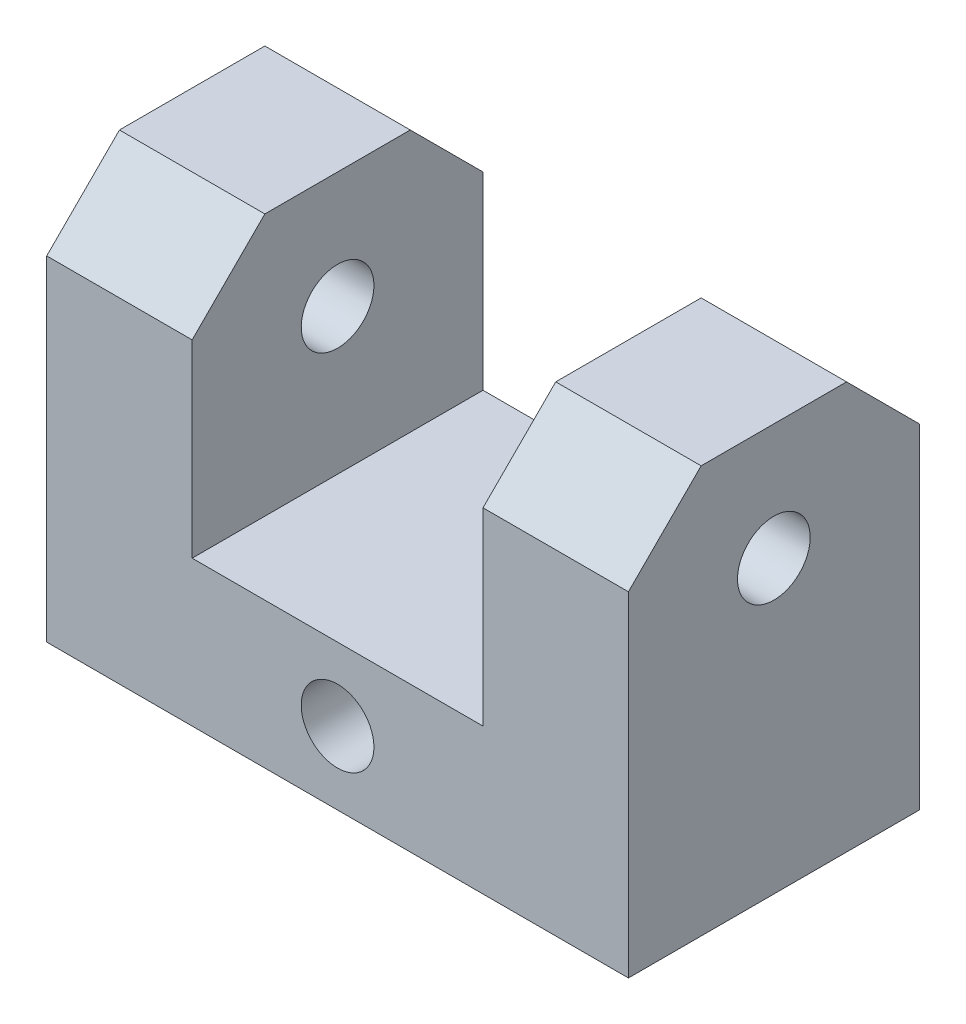
ISO-10303-21;
HEADER;
FILE_DESCRIPTION(('STEP AP214'),'2;1');
FILE_NAME('part.step','',(''),(''),'','','');
FILE_SCHEMA(('AUTOMOTIVE_DESIGN { 1 0 10303 214 1 1 1 1 }'));
ENDSEC;
DATA;
#1=APPLICATION_CONTEXT('core data for automotive mechanical design processes');
#2=APPLICATION_PROTOCOL_DEFINITION('international standard','automotive_design',2000,#1);
#3=PRODUCT_CONTEXT('',#1,'mechanical');
#4=PRODUCT('Part','Part','',(#3));
#5=PRODUCT_RELATED_PRODUCT_CATEGORY('part','',(#4));
#6=PRODUCT_DEFINITION_FORMATION('','',#4);
#7=PRODUCT_DEFINITION_CONTEXT('part definition',#1,'design');
#8=PRODUCT_DEFINITION('design','',#6,#7);
#9=PRODUCT_DEFINITION_SHAPE('','',#8);
#10=(LENGTH_UNIT() NAMED_UNIT(*) SI_UNIT(.MILLI.,.METRE.));
#11=(NAMED_UNIT(*) PLANE_ANGLE_UNIT() SI_UNIT($,.RADIAN.));
#12=(NAMED_UNIT(*) SI_UNIT($,.STERADIAN.) SOLID_ANGLE_UNIT());
#13=UNCERTAINTY_MEASURE_WITH_UNIT(LENGTH_MEASURE(1.E-05),#10,'distance_accuracy_value','');
#14=(GEOMETRIC_REPRESENTATION_CONTEXT(3) GLOBAL_UNCERTAINTY_ASSIGNED_CONTEXT((#13)) GLOBAL_UNIT_ASSIGNED_CONTEXT((#10,
#11,#12)) REPRESENTATION_CONTEXT('',''));
#15=CARTESIAN_POINT('',(0.,0.,0.));
#16=DIRECTION('',(0.,0.,1.));
#17=DIRECTION('',(1.,0.,0.));
#18=AXIS2_PLACEMENT_3D('',#15,#16,#17);
#19=CARTESIAN_POINT('',(0.,35.56,0.));
#20=DIRECTION('',(0.,-1.,0.));
#21=DIRECTION('',(0.,0.,-1.));
#22=AXIS2_PLACEMENT_3D('',#19,#20,#21);
#23=PLANE('',#22);
#24=DIRECTION('',(0.,0.,1.));
#25=VECTOR('',#24,1.);
#26=CARTESIAN_POINT('',(-25.4,35.56,-12.7));
#27=LINE('',#26,#25);
#28=CARTESIAN_POINT('',(-25.4,35.56,-6.34999999999999));
#29=VERTEX_POINT('',#28);
#30=CARTESIAN_POINT('',(-25.4,35.56,6.35));
#31=VERTEX_POINT('',#30);
#32=EDGE_CURVE('E166',#29,#31,#27,.T.);
#33=ORIENTED_EDGE('',*,*,#32,.T.);
#34=DIRECTION('',(1.,0.,0.));
#35=VECTOR('',#34,1.);
#36=CARTESIAN_POINT('',(0.,35.56,6.35));
#37=LINE('',#36,#35);
#38=CARTESIAN_POINT('',(-12.7,35.56,6.35));
#39=VERTEX_POINT('',#38);
#40=EDGE_CURVE('E198',#31,#39,#37,.T.);
#41=ORIENTED_EDGE('',*,*,#40,.T.);
#42=DIRECTION('',(0.,0.,1.));
#43=VECTOR('',#42,1.);
#44=CARTESIAN_POINT('',(-12.7,35.56,-12.7));
#45=LINE('',#44,#43);
#46=CARTESIAN_POINT('',(-12.7,35.56,-6.35));
#47=VERTEX_POINT('',#46);
#48=EDGE_CURVE('E154',#47,#39,#45,.T.);
#49=ORIENTED_EDGE('',*,*,#48,.F.);
#50=DIRECTION('',(-1.,0.,0.));
#51=VECTOR('',#50,1.);
#52=CARTESIAN_POINT('',(0.,35.56,-6.35));
#53=LINE('',#52,#51);
#54=EDGE_CURVE('E190',#47,#29,#53,.T.);
#55=ORIENTED_EDGE('',*,*,#54,.T.);
#56=EDGE_LOOP('',(#33,#41,#49,#55));
#57=FACE_BOUND('',#56,.T.);
#58=ADVANCED_FACE('F33',(#57),#23,.F.);
#59=CARTESIAN_POINT('',(-25.4,35.56,-12.7));
#60=DIRECTION('',(1.,0.,0.));
#61=DIRECTION('',(0.,0.,-1.));
#62=AXIS2_PLACEMENT_3D('',#59,#60,#61);
#63=PLANE('',#62);
#64=CARTESIAN_POINT('',(-25.4,25.4,0.));
#65=DIRECTION('',(1.,0.,0.));
#66=DIRECTION('',(0.,0.,-1.));
#67=AXIS2_PLACEMENT_3D('',#64,#65,#66);
#68=CIRCLE('',#67,3.175);
#69=CARTESIAN_POINT('',(-25.4,25.4,-3.17499999999999));
#70=VERTEX_POINT('',#69);
#71=EDGE_CURVE('E195',#70,#70,#68,.T.);
#72=ORIENTED_EDGE('',*,*,#71,.T.);
#73=EDGE_LOOP('',(#72));
#74=FACE_BOUND('',#73,.T.);
#75=DIRECTION('',(0.,-1.,0.));
#76=VECTOR('',#75,1.);
#77=CARTESIAN_POINT('',(-25.4,35.56,12.7));
#78=LINE('',#77,#76);
#79=CARTESIAN_POINT('',(-25.4,29.21,12.7));
#80=VERTEX_POINT('',#79);
#81=CARTESIAN_POINT('',(-25.4,0.,12.7));
#82=VERTEX_POINT('',#81);
#83=EDGE_CURVE('E188',#80,#82,#78,.T.);
#84=ORIENTED_EDGE('',*,*,#83,.F.);
#85=DIRECTION('',(0.,-0.707106781186549,0.707106781186546));
#86=VECTOR('',#85,1.);
#87=CARTESIAN_POINT('',(-25.4,35.56,6.35));
#88=LINE('',#87,#86);
#89=EDGE_CURVE('E211',#80,#31,#88,.F.);
#90=ORIENTED_EDGE('',*,*,#89,.T.);
#91=ORIENTED_EDGE('',*,*,#32,.F.);
#92=DIRECTION('',(0.,0.707106781186549,0.707106781186546));
#93=VECTOR('',#92,1.);
#94=CARTESIAN_POINT('',(-25.4,35.56,-6.34999999999999));
#95=LINE('',#94,#93);
#96=CARTESIAN_POINT('',(-25.4,29.21,-12.7));
#97=VERTEX_POINT('',#96);
#98=EDGE_CURVE('E209',#29,#97,#95,.F.);
#99=ORIENTED_EDGE('',*,*,#98,.T.);
#100=DIRECTION('',(0.,-1.,0.));
#101=VECTOR('',#100,1.);
#102=CARTESIAN_POINT('',(-25.4,35.56,-12.7));
#103=LINE('',#102,#101);
#104=CARTESIAN_POINT('',(-25.4,0.,-12.7));
#105=VERTEX_POINT('',#104);
#106=EDGE_CURVE('E172',#97,#105,#103,.T.);
#107=ORIENTED_EDGE('',*,*,#106,.T.);
#108=DIRECTION('',(0.,0.,1.));
#109=VECTOR('',#108,1.);
#110=CARTESIAN_POINT('',(-25.4,0.,-12.7));
#111=LINE('',#110,#109);
#112=EDGE_CURVE('E165',#105,#82,#111,.T.);
#113=ORIENTED_EDGE('',*,*,#112,.T.);
#114=EDGE_LOOP('',(#84,#90,#91,#99,#107,#113));
#115=FACE_BOUND('',#114,.T.);
#116=ADVANCED_FACE('F258',(#74,#115),#63,.F.);
#117=CARTESIAN_POINT('',(25.4,35.56,12.7));
#118=DIRECTION('',(0.,0.,-1.));
#119=DIRECTION('',(-1.,0.,0.));
#120=AXIS2_PLACEMENT_3D('',#117,#118,#119);
#121=PLANE('',#120);
#122=CARTESIAN_POINT('',(0.,6.35,12.7));
#123=DIRECTION('',(0.,0.,-1.));
#124=DIRECTION('',(-1.,0.,0.));
#125=AXIS2_PLACEMENT_3D('',#122,#123,#124);
#126=CIRCLE('',#125,3.175);
#127=CARTESIAN_POINT('',(3.175,6.35,12.7));
#128=VERTEX_POINT('',#127);
#129=EDGE_CURVE('E133',#128,#128,#126,.T.);
#130=ORIENTED_EDGE('',*,*,#129,.T.);
#131=EDGE_LOOP('',(#130));
#132=FACE_BOUND('',#131,.T.);
#133=DIRECTION('',(0.,1.,0.));
#134=VECTOR('',#133,1.);
#135=CARTESIAN_POINT('',(-12.7,35.56,12.7));
#136=LINE('',#135,#134);
#137=CARTESIAN_POINT('',(-12.7,12.7,12.7));
#138=VERTEX_POINT('',#137);
#139=CARTESIAN_POINT('',(-12.7,29.21,12.7));
#140=VERTEX_POINT('',#139);
#141=EDGE_CURVE('E140',#138,#140,#136,.T.);
#142=ORIENTED_EDGE('',*,*,#141,.T.);
#143=DIRECTION('',(-1.,0.,0.));
#144=VECTOR('',#143,1.);
#145=CARTESIAN_POINT('',(25.4,29.21,12.7));
#146=LINE('',#145,#144);
#147=EDGE_CURVE('E207',#140,#80,#146,.T.);
#148=ORIENTED_EDGE('',*,*,#147,.T.);
#149=ORIENTED_EDGE('',*,*,#83,.T.);
#150=DIRECTION('',(1.,0.,0.));
#151=VECTOR('',#150,1.);
#152=CARTESIAN_POINT('',(25.4,0.,12.7));
#153=LINE('',#152,#151);
#154=CARTESIAN_POINT('',(25.4,0.,12.7));
#155=VERTEX_POINT('',#154);
#156=EDGE_CURVE('E175',#82,#155,#153,.T.);
#157=ORIENTED_EDGE('',*,*,#156,.T.);
#158=DIRECTION('',(0.,-1.,0.));
#159=VECTOR('',#158,1.);
#160=CARTESIAN_POINT('',(25.4,35.56,12.7));
#161=LINE('',#160,#159);
#162=CARTESIAN_POINT('',(25.4,29.21,12.7));
#163=VERTEX_POINT('',#162);
#164=EDGE_CURVE('E186',#163,#155,#161,.T.);
#165=ORIENTED_EDGE('',*,*,#164,.F.);
#166=DIRECTION('',(-1.,0.,0.));
#167=VECTOR('',#166,1.);
#168=CARTESIAN_POINT('',(25.4,29.21,12.7));
#169=LINE('',#168,#167);
#170=CARTESIAN_POINT('',(12.7,29.21,12.7));
#171=VERTEX_POINT('',#170);
#172=EDGE_CURVE('E205',#163,#171,#169,.T.);
#173=ORIENTED_EDGE('',*,*,#172,.T.);
#174=DIRECTION('',(0.,-1.,0.));
#175=VECTOR('',#174,1.);
#176=CARTESIAN_POINT('',(12.7,35.56,12.7));
#177=LINE('',#176,#175);
#178=CARTESIAN_POINT('',(12.7,12.7,12.7));
#179=VERTEX_POINT('',#178);
#180=EDGE_CURVE('E156',#171,#179,#177,.T.);
#181=ORIENTED_EDGE('',*,*,#180,.T.);
#182=DIRECTION('',(-1.,0.,0.));
#183=VECTOR('',#182,1.);
#184=CARTESIAN_POINT('',(25.4,12.7,12.7));
#185=LINE('',#184,#183);
#186=EDGE_CURVE('E163',#179,#138,#185,.T.);
#187=ORIENTED_EDGE('',*,*,#186,.T.);
#188=EDGE_LOOP('',(#142,#148,#149,#157,#165,#173,#181,#187));
#189=FACE_BOUND('',#188,.T.);
#190=ADVANCED_FACE('F227',(#132,#189),#121,.F.);
#191=CARTESIAN_POINT('',(25.4,35.56,-12.7));
#192=DIRECTION('',(-1.,0.,0.));
#193=DIRECTION('',(0.,0.,1.));
#194=AXIS2_PLACEMENT_3D('',#191,#192,#193);
#195=PLANE('',#194);
#196=CARTESIAN_POINT('',(25.4,25.4,0.));
#197=DIRECTION('',(-1.,0.,0.));
#198=DIRECTION('',(0.,0.,1.));
#199=AXIS2_PLACEMENT_3D('',#196,#197,#198);
#200=CIRCLE('',#199,3.175);
#201=CARTESIAN_POINT('',(25.4,25.4,3.17500000000001));
#202=VERTEX_POINT('',#201);
#203=EDGE_CURVE('E410',#202,#202,#200,.T.);
#204=ORIENTED_EDGE('',*,*,#203,.T.);
#205=EDGE_LOOP('',(#204));
#206=FACE_BOUND('',#205,.T.);
#207=DIRECTION('',(0.,-1.,0.));
#208=VECTOR('',#207,1.);
#209=CARTESIAN_POINT('',(25.4,35.56,-12.7));
#210=LINE('',#209,#208);
#211=CARTESIAN_POINT('',(25.4,29.21,-12.7));
#212=VERTEX_POINT('',#211);
#213=CARTESIAN_POINT('',(25.4,0.,-12.7));
#214=VERTEX_POINT('',#213);
#215=EDGE_CURVE('E184',#212,#214,#210,.T.);
#216=ORIENTED_EDGE('',*,*,#215,.F.);
#217=DIRECTION('',(0.,-0.707106781186549,-0.707106781186546));
#218=VECTOR('',#217,1.);
#219=CARTESIAN_POINT('',(25.4,35.56,-6.35000000000001));
#220=LINE('',#219,#218);
#221=CARTESIAN_POINT('',(25.4,35.56,-6.35000000000001));
#222=VERTEX_POINT('',#221);
#223=EDGE_CURVE('E11',#212,#222,#220,.F.);
#224=ORIENTED_EDGE('',*,*,#223,.T.);
#225=DIRECTION('',(0.,0.,-1.));
#226=VECTOR('',#225,1.);
#227=CARTESIAN_POINT('',(25.4,35.56,-12.7));
#228=LINE('',#227,#226);
#229=CARTESIAN_POINT('',(25.4,35.56,6.35000000000001));
#230=VERTEX_POINT('',#229);
#231=EDGE_CURVE('E169',#230,#222,#228,.T.);
#232=ORIENTED_EDGE('',*,*,#231,.F.);
#233=DIRECTION('',(0.,0.707106781186549,-0.707106781186546));
#234=VECTOR('',#233,1.);
#235=CARTESIAN_POINT('',(25.4,35.56,6.35000000000001));
#236=LINE('',#235,#234);
#237=EDGE_CURVE('E41',#230,#163,#236,.F.);
#238=ORIENTED_EDGE('',*,*,#237,.T.);
#239=ORIENTED_EDGE('',*,*,#164,.T.);
#240=DIRECTION('',(0.,0.,-1.));
#241=VECTOR('',#240,1.);
#242=CARTESIAN_POINT('',(25.4,0.,-12.7));
#243=LINE('',#242,#241);
#244=EDGE_CURVE('E178',#155,#214,#243,.T.);
#245=ORIENTED_EDGE('',*,*,#244,.T.);
#246=EDGE_LOOP('',(#216,#224,#232,#238,#239,#245));
#247=FACE_BOUND('',#246,.T.);
#248=ADVANCED_FACE('F225',(#206,#247),#195,.F.);
#249=CARTESIAN_POINT('',(25.4,35.56,-12.7));
#250=DIRECTION('',(0.,0.,1.));
#251=DIRECTION('',(1.,0.,0.));
#252=AXIS2_PLACEMENT_3D('',#249,#250,#251);
#253=PLANE('',#252);
#254=CARTESIAN_POINT('',(0.,6.35,-12.7));
#255=DIRECTION('',(0.,0.,1.));
#256=DIRECTION('',(1.,0.,0.));
#257=AXIS2_PLACEMENT_3D('',#254,#255,#256);
#258=CIRCLE('',#257,3.175);
#259=CARTESIAN_POINT('',(3.175,6.35,-12.7));
#260=VERTEX_POINT('',#259);
#261=EDGE_CURVE('E407',#260,#260,#258,.T.);
#262=ORIENTED_EDGE('',*,*,#261,.T.);
#263=EDGE_LOOP('',(#262));
#264=FACE_BOUND('',#263,.T.);
#265=ORIENTED_EDGE('',*,*,#106,.F.);
#266=DIRECTION('',(1.,0.,0.));
#267=VECTOR('',#266,1.);
#268=CARTESIAN_POINT('',(25.4,29.21,-12.7));
#269=LINE('',#268,#267);
#270=CARTESIAN_POINT('',(-12.7,29.21,-12.7));
#271=VERTEX_POINT('',#270);
#272=EDGE_CURVE('E130',#97,#271,#269,.T.);
#273=ORIENTED_EDGE('',*,*,#272,.T.);
#274=DIRECTION('',(0.,-1.,0.));
#275=VECTOR('',#274,1.);
#276=CARTESIAN_POINT('',(-12.7,35.56,-12.7));
#277=LINE('',#276,#275);
#278=CARTESIAN_POINT('',(-12.7,12.7,-12.7));
#279=VERTEX_POINT('',#278);
#280=EDGE_CURVE('E122',#271,#279,#277,.T.);
#281=ORIENTED_EDGE('',*,*,#280,.T.);
#282=DIRECTION('',(1.,0.,0.));
#283=VECTOR('',#282,1.);
#284=CARTESIAN_POINT('',(-12.7,12.7,-12.7));
#285=LINE('',#284,#283);
#286=CARTESIAN_POINT('',(12.7,12.7,-12.7));
#287=VERTEX_POINT('',#286);
#288=EDGE_CURVE('E128',#279,#287,#285,.T.);
#289=ORIENTED_EDGE('',*,*,#288,.T.);
#290=DIRECTION('',(0.,1.,0.));
#291=VECTOR('',#290,1.);
#292=CARTESIAN_POINT('',(12.7,35.56,-12.7));
#293=LINE('',#292,#291);
#294=CARTESIAN_POINT('',(12.7,29.21,-12.7));
#295=VERTEX_POINT('',#294);
#296=EDGE_CURVE('E145',#287,#295,#293,.T.);
#297=ORIENTED_EDGE('',*,*,#296,.T.);
#298=DIRECTION('',(1.,0.,0.));
#299=VECTOR('',#298,1.);
#300=CARTESIAN_POINT('',(25.4,29.21,-12.7));
#301=LINE('',#300,#299);
#302=EDGE_CURVE('E213',#295,#212,#301,.T.);
#303=ORIENTED_EDGE('',*,*,#302,.T.);
#304=ORIENTED_EDGE('',*,*,#215,.T.);
#305=DIRECTION('',(-1.,0.,0.));
#306=VECTOR('',#305,1.);
#307=CARTESIAN_POINT('',(25.4,0.,-12.7));
#308=LINE('',#307,#306);
#309=EDGE_CURVE('E170',#214,#105,#308,.T.);
#310=ORIENTED_EDGE('',*,*,#309,.T.);
#311=EDGE_LOOP('',(#265,#273,#281,#289,#297,#303,#304,#310));
#312=FACE_BOUND('',#311,.T.);
#313=ADVANCED_FACE('F125',(#264,#312),#253,.F.);
#314=ORIENTED_EDGE('',*,*,#231,.T.);
#315=DIRECTION('',(-1.,0.,0.));
#316=VECTOR('',#315,1.);
#317=CARTESIAN_POINT('',(0.,35.56,-6.35000000000001));
#318=LINE('',#317,#316);
#319=CARTESIAN_POINT('',(12.7,35.56,-6.35000000000001));
#320=VERTEX_POINT('',#319);
#321=EDGE_CURVE('E218',#222,#320,#318,.T.);
#322=ORIENTED_EDGE('',*,*,#321,.T.);
#323=DIRECTION('',(0.,0.,1.));
#324=VECTOR('',#323,1.);
#325=CARTESIAN_POINT('',(12.7,35.56,-12.7));
#326=LINE('',#325,#324);
#327=CARTESIAN_POINT('',(12.7,35.56,6.35));
#328=VERTEX_POINT('',#327);
#329=EDGE_CURVE('E157',#320,#328,#326,.T.);
#330=ORIENTED_EDGE('',*,*,#329,.T.);
#331=DIRECTION('',(1.,0.,0.));
#332=VECTOR('',#331,1.);
#333=CARTESIAN_POINT('',(0.,35.56,6.35000000000002));
#334=LINE('',#333,#332);
#335=EDGE_CURVE('E216',#328,#230,#334,.T.);
#336=ORIENTED_EDGE('',*,*,#335,.T.);
#337=EDGE_LOOP('',(#314,#322,#330,#336));
#338=FACE_BOUND('',#337,.T.);
#339=ADVANCED_FACE('F236',(#338),#23,.F.);
#340=CARTESIAN_POINT('',(0.,0.,0.));
#341=DIRECTION('',(0.,-1.,0.));
#342=DIRECTION('',(0.,0.,-1.));
#343=AXIS2_PLACEMENT_3D('',#340,#341,#342);
#344=PLANE('',#343);
#345=ORIENTED_EDGE('',*,*,#112,.F.);
#346=ORIENTED_EDGE('',*,*,#309,.F.);
#347=ORIENTED_EDGE('',*,*,#244,.F.);
#348=ORIENTED_EDGE('',*,*,#156,.F.);
#349=EDGE_LOOP('',(#345,#346,#347,#348));
#350=FACE_BOUND('',#349,.T.);
#351=ADVANCED_FACE('F244',(#350),#344,.T.);
#352=CARTESIAN_POINT('',(-12.7,12.7,-12.7));
#353=DIRECTION('',(0.,-1.,0.));
#354=DIRECTION('',(0.,0.,-1.));
#355=AXIS2_PLACEMENT_3D('',#352,#353,#354);
#356=PLANE('',#355);
#357=DIRECTION('',(0.,0.,1.));
#358=VECTOR('',#357,1.);
#359=CARTESIAN_POINT('',(12.7,12.7,-12.7));
#360=LINE('',#359,#358);
#361=EDGE_CURVE('E144',#287,#179,#360,.T.);
#362=ORIENTED_EDGE('',*,*,#361,.F.);
#363=ORIENTED_EDGE('',*,*,#288,.F.);
#364=DIRECTION('',(0.,0.,1.));
#365=VECTOR('',#364,1.);
#366=CARTESIAN_POINT('',(-12.7,12.7,-12.7));
#367=LINE('',#366,#365);
#368=EDGE_CURVE('E136',#279,#138,#367,.T.);
#369=ORIENTED_EDGE('',*,*,#368,.T.);
#370=ORIENTED_EDGE('',*,*,#186,.F.);
#371=EDGE_LOOP('',(#362,#363,#369,#370));
#372=FACE_BOUND('',#371,.T.);
#373=ADVANCED_FACE('F147',(#372),#356,.F.);
#374=CARTESIAN_POINT('',(-12.7,35.56,-12.7));
#375=DIRECTION('',(-1.,0.,0.));
#376=DIRECTION('',(0.,-1.,0.));
#377=AXIS2_PLACEMENT_3D('',#374,#375,#376);
#378=PLANE('',#377);
#379=CARTESIAN_POINT('',(-12.7,25.4,0.));
#380=DIRECTION('',(-1.,0.,0.));
#381=DIRECTION('',(0.,-1.,0.));
#382=AXIS2_PLACEMENT_3D('',#379,#380,#381);
#383=CIRCLE('',#382,3.175);
#384=CARTESIAN_POINT('',(-12.7,22.225,0.));
#385=VERTEX_POINT('',#384);
#386=EDGE_CURVE('E194',#385,#385,#383,.T.);
#387=ORIENTED_EDGE('',*,*,#386,.T.);
#388=EDGE_LOOP('',(#387));
#389=FACE_BOUND('',#388,.T.);
#390=ORIENTED_EDGE('',*,*,#48,.T.);
#391=DIRECTION('',(0.,0.707106781186549,-0.707106781186546));
#392=VECTOR('',#391,1.);
#393=CARTESIAN_POINT('',(-12.7,35.56,6.35));
#394=LINE('',#393,#392);
#395=EDGE_CURVE('E203',#39,#140,#394,.F.);
#396=ORIENTED_EDGE('',*,*,#395,.T.);
#397=ORIENTED_EDGE('',*,*,#141,.F.);
#398=ORIENTED_EDGE('',*,*,#368,.F.);
#399=ORIENTED_EDGE('',*,*,#280,.F.);
#400=DIRECTION('',(0.,-0.707106781186549,-0.707106781186546));
#401=VECTOR('',#400,1.);
#402=CARTESIAN_POINT('',(-12.7,35.56,-6.35));
#403=LINE('',#402,#401);
#404=EDGE_CURVE('E201',#271,#47,#403,.F.);
#405=ORIENTED_EDGE('',*,*,#404,.T.);
#406=EDGE_LOOP('',(#390,#396,#397,#398,#399,#405));
#407=FACE_BOUND('',#406,.T.);
#408=ADVANCED_FACE('F138',(#389,#407),#378,.F.);
#409=CARTESIAN_POINT('',(12.7,35.56,-12.7));
#410=DIRECTION('',(1.,0.,0.));
#411=DIRECTION('',(0.,1.,0.));
#412=AXIS2_PLACEMENT_3D('',#409,#410,#411);
#413=PLANE('',#412);
#414=CARTESIAN_POINT('',(12.7,25.4,0.));
#415=DIRECTION('',(1.,0.,0.));
#416=DIRECTION('',(0.,1.,0.));
#417=AXIS2_PLACEMENT_3D('',#414,#415,#416);
#418=CIRCLE('',#417,3.175);
#419=CARTESIAN_POINT('',(12.7,28.575,0.));
#420=VERTEX_POINT('',#419);
#421=EDGE_CURVE('E191',#420,#420,#418,.T.);
#422=ORIENTED_EDGE('',*,*,#421,.T.);
#423=EDGE_LOOP('',(#422));
#424=FACE_BOUND('',#423,.T.);
#425=ORIENTED_EDGE('',*,*,#329,.F.);
#426=DIRECTION('',(0.,0.707106781186549,0.707106781186546));
#427=VECTOR('',#426,1.);
#428=CARTESIAN_POINT('',(12.7,35.56,-6.35000000000001));
#429=LINE('',#428,#427);
#430=EDGE_CURVE('E223',#320,#295,#429,.F.);
#431=ORIENTED_EDGE('',*,*,#430,.T.);
#432=ORIENTED_EDGE('',*,*,#296,.F.);
#433=ORIENTED_EDGE('',*,*,#361,.T.);
#434=ORIENTED_EDGE('',*,*,#180,.F.);
#435=DIRECTION('',(0.,-0.707106781186549,0.707106781186546));
#436=VECTOR('',#435,1.);
#437=CARTESIAN_POINT('',(12.7,35.56,6.35000000000001));
#438=LINE('',#437,#436);
#439=EDGE_CURVE('E221',#171,#328,#438,.F.);
#440=ORIENTED_EDGE('',*,*,#439,.T.);
#441=EDGE_LOOP('',(#425,#431,#432,#433,#434,#440));
#442=FACE_BOUND('',#441,.T.);
#443=ADVANCED_FACE('F234',(#424,#442),#413,.F.);
#444=CARTESIAN_POINT('',(0.,6.35,-12.7));
#445=DIRECTION('',(0.,0.,1.));
#446=DIRECTION('',(1.,0.,0.));
#447=AXIS2_PLACEMENT_3D('',#444,#445,#446);
#448=CYLINDRICAL_SURFACE('',#447,3.175);
#449=CARTESIAN_POINT('',(3.175,6.35,-12.7));
#450=CARTESIAN_POINT('',(3.175,6.35,-12.4354166666667));
#451=CARTESIAN_POINT('',(3.175,6.35,-12.1708333333333));
#452=CARTESIAN_POINT('',(3.175,6.35,-11.6416666666667));
#453=CARTESIAN_POINT('',(3.175,6.35,-11.3770833333333));
#454=CARTESIAN_POINT('',(3.175,6.35,-10.8479166666667));
#455=CARTESIAN_POINT('',(3.175,6.35,-10.5833333333333));
#456=CARTESIAN_POINT('',(3.175,6.35,-10.0541666666667));
#457=CARTESIAN_POINT('',(3.175,6.35,-9.78958333333333));
#458=CARTESIAN_POINT('',(3.175,6.35,-9.26041666666667));
#459=CARTESIAN_POINT('',(3.175,6.35,-8.99583333333333));
#460=CARTESIAN_POINT('',(3.175,6.35,-8.46666666666667));
#461=CARTESIAN_POINT('',(3.175,6.35,-8.20208333333333));
#462=CARTESIAN_POINT('',(3.175,6.35,-7.67291666666667));
#463=CARTESIAN_POINT('',(3.175,6.35,-7.40833333333333));
#464=CARTESIAN_POINT('',(3.175,6.35,-6.87916666666667));
#465=CARTESIAN_POINT('',(3.175,6.35,-6.61458333333333));
#466=CARTESIAN_POINT('',(3.175,6.35,-6.08541666666667));
#467=CARTESIAN_POINT('',(3.175,6.35,-5.82083333333333));
#468=CARTESIAN_POINT('',(3.175,6.35,-5.29166666666667));
#469=CARTESIAN_POINT('',(3.175,6.35,-5.02708333333333));
#470=CARTESIAN_POINT('',(3.175,6.35,-4.49791666666667));
#471=CARTESIAN_POINT('',(3.175,6.35,-4.23333333333333));
#472=CARTESIAN_POINT('',(3.175,6.35,-3.70416666666667));
#473=CARTESIAN_POINT('',(3.175,6.35,-3.43958333333333));
#474=CARTESIAN_POINT('',(3.175,6.35,-2.91041666666667));
#475=CARTESIAN_POINT('',(3.175,6.35,-2.64583333333333));
#476=CARTESIAN_POINT('',(3.175,6.35,-2.11666666666667));
#477=CARTESIAN_POINT('',(3.175,6.35,-1.85208333333333));
#478=CARTESIAN_POINT('',(3.175,6.35,-1.32291666666666));
#479=CARTESIAN_POINT('',(3.175,6.35,-1.05833333333333));
#480=CARTESIAN_POINT('',(3.175,6.35,-0.529166666666664));
#481=CARTESIAN_POINT('',(3.175,6.35,-0.264583333333331));
#482=CARTESIAN_POINT('',(3.175,6.35,0.264583333333335));
#483=CARTESIAN_POINT('',(3.175,6.35,0.529166666666668));
#484=CARTESIAN_POINT('',(3.175,6.35,1.05833333333333));
#485=CARTESIAN_POINT('',(3.175,6.35,1.32291666666667));
#486=CARTESIAN_POINT('',(3.175,6.35,1.85208333333334));
#487=CARTESIAN_POINT('',(3.175,6.35,2.11666666666667));
#488=CARTESIAN_POINT('',(3.175,6.35,2.64583333333334));
#489=CARTESIAN_POINT('',(3.175,6.35,2.91041666666667));
#490=CARTESIAN_POINT('',(3.175,6.35,3.43958333333333));
#491=CARTESIAN_POINT('',(3.175,6.35,3.70416666666667));
#492=CARTESIAN_POINT('',(3.175,6.35,4.23333333333333));
#493=CARTESIAN_POINT('',(3.175,6.35,4.49791666666667));
#494=CARTESIAN_POINT('',(3.175,6.35,5.02708333333334));
#495=CARTESIAN_POINT('',(3.175,6.35,5.29166666666667));
#496=CARTESIAN_POINT('',(3.175,6.35,5.82083333333333));
#497=CARTESIAN_POINT('',(3.175,6.35,6.08541666666667));
#498=CARTESIAN_POINT('',(3.175,6.35,6.61458333333333));
#499=CARTESIAN_POINT('',(3.175,6.35,6.87916666666667));
#500=CARTESIAN_POINT('',(3.175,6.35,7.40833333333333));
#501=CARTESIAN_POINT('',(3.175,6.35,7.67291666666667));
#502=CARTESIAN_POINT('',(3.175,6.35,8.20208333333333));
#503=CARTESIAN_POINT('',(3.175,6.35,8.46666666666667));
#504=CARTESIAN_POINT('',(3.175,6.35,8.99583333333334));
#505=CARTESIAN_POINT('',(3.175,6.35,9.26041666666667));
#506=CARTESIAN_POINT('',(3.175,6.35,9.78958333333334));
#507=CARTESIAN_POINT('',(3.175,6.35,10.0541666666667));
#508=CARTESIAN_POINT('',(3.175,6.35,10.5833333333333));
#509=CARTESIAN_POINT('',(3.175,6.35,10.8479166666667));
#510=CARTESIAN_POINT('',(3.175,6.35,11.3770833333333));
#511=CARTESIAN_POINT('',(3.175,6.35,11.6416666666667));
#512=CARTESIAN_POINT('',(3.175,6.35,12.1708333333333));
#513=CARTESIAN_POINT('',(3.175,6.35,12.4354166666667));
#514=CARTESIAN_POINT('',(3.175,6.35,12.7));
#515=B_SPLINE_CURVE_WITH_KNOTS('',3,(#449,#450,#451,#452,#453,#454,#455,#456,#457,#458,#459,
#460,#461,#462,#463,#464,#465,#466,#467,#468,#469,#470,#471,#472,#473,#474,#475,#476,#477,#478,
#479,#480,#481,#482,#483,#484,#485,#486,#487,#488,#489,#490,#491,#492,#493,#494,#495,#496,#497,
#498,#499,#500,#501,#502,#503,#504,#505,#506,#507,#508,#509,#510,#511,#512,#513,#514),
.UNSPECIFIED.,.F.,.F.,(4,2,2,2,2,2,2,2,2,2,2,2,2,2,2,2,2,2,2,2,2,2,2,2,2,2,2,2,2,2,2,2,4),(0.,
0.793749999999999,1.5875,2.38125,3.175,3.96875,4.7625,5.55625,6.35,7.14375,7.9375,8.73125,9.525,
10.31875,11.1125,11.90625,12.7,13.49375,14.2875,15.08125,15.875,16.66875,17.4625,18.25625,19.05,
19.84375,20.6375,21.43125,22.225,23.01875,23.8125,24.60625,25.4),.UNSPECIFIED.);
#516=EDGE_CURVE('BSEAM309',#260,#128,#515,.T.);
#517=ORIENTED_EDGE('',*,*,#261,.F.);
#518=ORIENTED_EDGE('',*,*,#129,.F.);
#519=ORIENTED_EDGE('',*,*,#516,.T.);
#520=ORIENTED_EDGE('',*,*,#516,.F.);
#521=EDGE_LOOP('',(#517,#519,#518,#520));
#522=FACE_BOUND('',#521,.T.);
#523=ADVANCED_FACE('F309',(#522),#448,.F.);
#524=CARTESIAN_POINT('',(-25.4,25.4,0.));
#525=DIRECTION('',(1.,0.,0.));
#526=DIRECTION('',(0.,0.,-1.));
#527=AXIS2_PLACEMENT_3D('',#524,#525,#526);
#528=CYLINDRICAL_SURFACE('',#527,3.175);
#529=ORIENTED_EDGE('',*,*,#421,.F.);
#530=EDGE_LOOP('',(#529));
#531=FACE_BOUND('',#530,.T.);
#532=ORIENTED_EDGE('',*,*,#203,.F.);
#533=EDGE_LOOP('',(#532));
#534=FACE_BOUND('',#533,.T.);
#535=ADVANCED_FACE('F372',(#531,#534),#528,.F.);
#536=ORIENTED_EDGE('',*,*,#71,.F.);
#537=EDGE_LOOP('',(#536));
#538=FACE_BOUND('',#537,.T.);
#539=ORIENTED_EDGE('',*,*,#386,.F.);
#540=EDGE_LOOP('',(#539));
#541=FACE_BOUND('',#540,.T.);
#542=ADVANCED_FACE('F274',(#538,#541),#528,.F.);
#543=CARTESIAN_POINT('',(0.,35.56,6.35));
#544=DIRECTION('',(0.,-0.707106781186546,-0.707106781186549));
#545=DIRECTION('',(1.,0.,0.));
#546=AXIS2_PLACEMENT_3D('',#543,#544,#545);
#547=PLANE('',#546);
#548=ORIENTED_EDGE('',*,*,#89,.F.);
#549=ORIENTED_EDGE('',*,*,#147,.F.);
#550=ORIENTED_EDGE('',*,*,#395,.F.);
#551=ORIENTED_EDGE('',*,*,#40,.F.);
#552=EDGE_LOOP('',(#548,#549,#550,#551));
#553=FACE_BOUND('',#552,.T.);
#554=ADVANCED_FACE('F255',(#553),#547,.F.);
#555=CARTESIAN_POINT('',(0.,35.56,-6.35));
#556=DIRECTION('',(0.,-0.707106781186546,0.707106781186549));
#557=DIRECTION('',(-1.,0.,0.));
#558=AXIS2_PLACEMENT_3D('',#555,#556,#557);
#559=PLANE('',#558);
#560=ORIENTED_EDGE('',*,*,#404,.F.);
#561=ORIENTED_EDGE('',*,*,#272,.F.);
#562=ORIENTED_EDGE('',*,*,#98,.F.);
#563=ORIENTED_EDGE('',*,*,#54,.F.);
#564=EDGE_LOOP('',(#560,#561,#562,#563));
#565=FACE_BOUND('',#564,.T.);
#566=ADVANCED_FACE('F247',(#565),#559,.F.);
#567=CARTESIAN_POINT('',(0.,35.56,-6.35000000000001));
#568=DIRECTION('',(0.,-0.707106781186546,0.707106781186549));
#569=DIRECTION('',(-1.,0.,0.));
#570=AXIS2_PLACEMENT_3D('',#567,#568,#569);
#571=PLANE('',#570);
#572=ORIENTED_EDGE('',*,*,#223,.F.);
#573=ORIENTED_EDGE('',*,*,#302,.F.);
#574=ORIENTED_EDGE('',*,*,#430,.F.);
#575=ORIENTED_EDGE('',*,*,#321,.F.);
#576=EDGE_LOOP('',(#572,#573,#574,#575));
#577=FACE_BOUND('',#576,.T.);
#578=ADVANCED_FACE('F239',(#577),#571,.F.);
#579=CARTESIAN_POINT('',(0.,35.56,6.35000000000002));
#580=DIRECTION('',(0.,-0.707106781186546,-0.707106781186549));
#581=DIRECTION('',(1.,0.,0.));
#582=AXIS2_PLACEMENT_3D('',#579,#580,#581);
#583=PLANE('',#582);
#584=ORIENTED_EDGE('',*,*,#439,.F.);
#585=ORIENTED_EDGE('',*,*,#172,.F.);
#586=ORIENTED_EDGE('',*,*,#237,.F.);
#587=ORIENTED_EDGE('',*,*,#335,.F.);
#588=EDGE_LOOP('',(#584,#585,#586,#587));
#589=FACE_BOUND('',#588,.T.);
#590=ADVANCED_FACE('F35',(#589),#583,.F.);
#591=CLOSED_SHELL('',(#58,#116,#190,#248,#313,#339,#351,#373,#408,#443,#523,#535,#542,#554,#566,
#578,#590));
#592=MANIFOLD_SOLID_BREP('B2',#591);
#593=ADVANCED_BREP_SHAPE_REPRESENTATION('',(#18,#592),#14);
#594=SHAPE_DEFINITION_REPRESENTATION(#9,#593);
ENDSEC;
END-ISO-10303-21;
